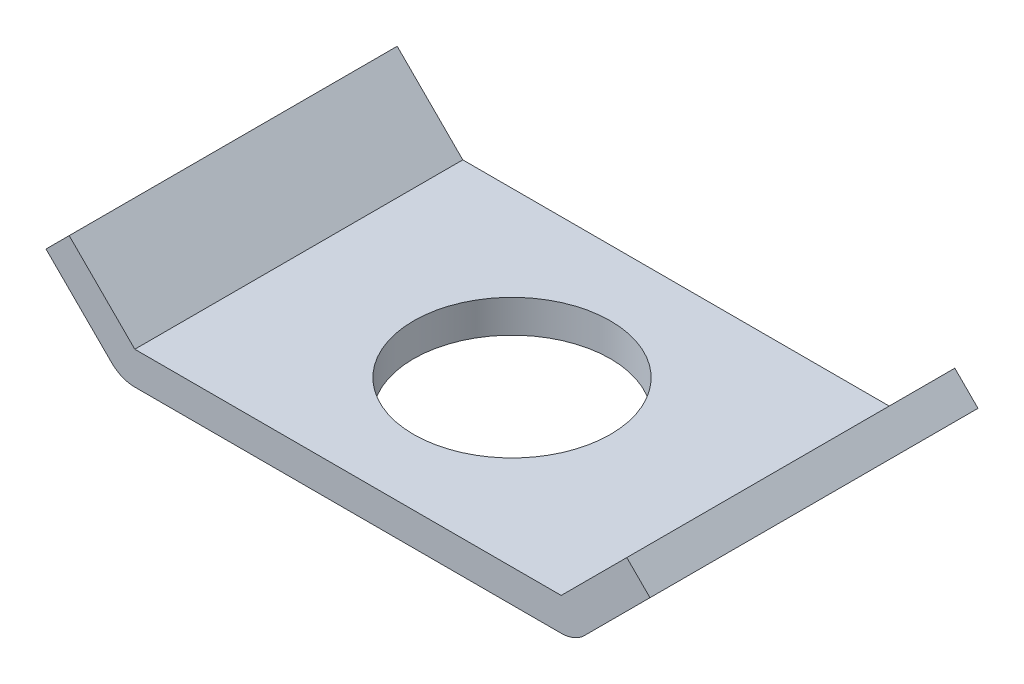
ISO-10303-21;
HEADER;
FILE_DESCRIPTION(('STEP AP214'),'2;1');
FILE_NAME('part.step','',(''),(''),'','','');
FILE_SCHEMA(('AUTOMOTIVE_DESIGN { 1 0 10303 214 1 1 1 1 }'));
ENDSEC;
DATA;
#1=APPLICATION_CONTEXT('core data for automotive mechanical design processes');
#2=APPLICATION_PROTOCOL_DEFINITION('international standard','automotive_design',2000,#1);
#3=PRODUCT_CONTEXT('',#1,'mechanical');
#4=PRODUCT('Part','Part','',(#3));
#5=PRODUCT_RELATED_PRODUCT_CATEGORY('part','',(#4));
#6=PRODUCT_DEFINITION_FORMATION('','',#4);
#7=PRODUCT_DEFINITION_CONTEXT('part definition',#1,'design');
#8=PRODUCT_DEFINITION('design','',#6,#7);
#9=PRODUCT_DEFINITION_SHAPE('','',#8);
#10=(LENGTH_UNIT() NAMED_UNIT(*) SI_UNIT(.MILLI.,.METRE.));
#11=(NAMED_UNIT(*) PLANE_ANGLE_UNIT() SI_UNIT($,.RADIAN.));
#12=(NAMED_UNIT(*) SI_UNIT($,.STERADIAN.) SOLID_ANGLE_UNIT());
#13=UNCERTAINTY_MEASURE_WITH_UNIT(LENGTH_MEASURE(1.E-05),#10,'distance_accuracy_value','');
#14=(GEOMETRIC_REPRESENTATION_CONTEXT(3) GLOBAL_UNCERTAINTY_ASSIGNED_CONTEXT((#13)) GLOBAL_UNIT_ASSIGNED_CONTEXT((#10,
#11,#12)) REPRESENTATION_CONTEXT('',''));
#15=CARTESIAN_POINT('',(0.,0.,0.));
#16=DIRECTION('',(0.,0.,1.));
#17=DIRECTION('',(1.,0.,0.));
#18=AXIS2_PLACEMENT_3D('',#15,#16,#17);
#19=CARTESIAN_POINT('',(-3.25,0.,2.5));
#20=DIRECTION('',(-0.707106781186548,-0.707106781186548,0.));
#21=DIRECTION('',(0.707106781186548,-0.707106781186548,0.));
#22=AXIS2_PLACEMENT_3D('',#19,#20,#21);
#23=PLANE('',#22);
#24=DIRECTION('',(-0.707106781186548,0.707106781186548,0.));
#25=VECTOR('',#24,1.);
#26=CARTESIAN_POINT('',(-3.25,0.,-2.5));
#27=LINE('',#26,#25);
#28=CARTESIAN_POINT('',(-3.25,0.,-2.5));
#29=VERTEX_POINT('',#28);
#30=CARTESIAN_POINT('',(-4.25,1.,-2.5));
#31=VERTEX_POINT('',#30);
#32=EDGE_CURVE('E141',#29,#31,#27,.T.);
#33=ORIENTED_EDGE('',*,*,#32,.T.);
#34=DIRECTION('',(0.,0.,-1.));
#35=VECTOR('',#34,1.);
#36=CARTESIAN_POINT('',(-4.25,1.,2.5));
#37=LINE('',#36,#35);
#38=CARTESIAN_POINT('',(-4.25,1.,2.5));
#39=VERTEX_POINT('',#38);
#40=EDGE_CURVE('E11',#39,#31,#37,.T.);
#41=ORIENTED_EDGE('',*,*,#40,.F.);
#42=DIRECTION('',(-0.707106781186548,0.707106781186548,0.));
#43=VECTOR('',#42,1.);
#44=CARTESIAN_POINT('',(-3.25,0.,2.5));
#45=LINE('',#44,#43);
#46=CARTESIAN_POINT('',(-3.25,0.,2.5));
#47=VERTEX_POINT('',#46);
#48=EDGE_CURVE('E159',#47,#39,#45,.T.);
#49=ORIENTED_EDGE('',*,*,#48,.F.);
#50=DIRECTION('',(0.,0.,-1.));
#51=VECTOR('',#50,1.);
#52=CARTESIAN_POINT('',(-3.25,0.,2.5));
#53=LINE('',#52,#51);
#54=EDGE_CURVE('E137',#47,#29,#53,.T.);
#55=ORIENTED_EDGE('',*,*,#54,.T.);
#56=EDGE_LOOP('',(#33,#41,#49,#55));
#57=FACE_BOUND('',#56,.T.);
#58=ADVANCED_FACE('F32',(#57),#23,.F.);
#59=CARTESIAN_POINT('',(-4.25,1.,2.5));
#60=DIRECTION('',(0.707106781186548,-0.707106781186547,0.));
#61=DIRECTION('',(0.707106781186547,0.707106781186548,0.));
#62=AXIS2_PLACEMENT_3D('',#59,#60,#61);
#63=PLANE('',#62);
#64=DIRECTION('',(-0.707106781186547,-0.707106781186548,0.));
#65=VECTOR('',#64,1.);
#66=CARTESIAN_POINT('',(-4.25,1.,-2.5));
#67=LINE('',#66,#65);
#68=CARTESIAN_POINT('',(-4.60355339059327,0.646446609406725,-2.5));
#69=VERTEX_POINT('',#68);
#70=EDGE_CURVE('E144',#31,#69,#67,.T.);
#71=ORIENTED_EDGE('',*,*,#70,.T.);
#72=DIRECTION('',(0.,0.,-1.));
#73=VECTOR('',#72,1.);
#74=CARTESIAN_POINT('',(-4.60355339059327,0.646446609406725,2.5));
#75=LINE('',#74,#73);
#76=CARTESIAN_POINT('',(-4.60355339059327,0.646446609406725,2.5));
#77=VERTEX_POINT('',#76);
#78=EDGE_CURVE('E41',#77,#69,#75,.T.);
#79=ORIENTED_EDGE('',*,*,#78,.F.);
#80=DIRECTION('',(-0.707106781186547,-0.707106781186548,0.));
#81=VECTOR('',#80,1.);
#82=CARTESIAN_POINT('',(-4.25,1.,2.5));
#83=LINE('',#82,#81);
#84=EDGE_CURVE('E98',#39,#77,#83,.T.);
#85=ORIENTED_EDGE('',*,*,#84,.F.);
#86=ORIENTED_EDGE('',*,*,#40,.T.);
#87=EDGE_LOOP('',(#71,#79,#85,#86));
#88=FACE_BOUND('',#87,.T.);
#89=ADVANCED_FACE('F225',(#88),#63,.F.);
#90=CARTESIAN_POINT('',(-3.60355339059328,-0.353553390593272,2.5));
#91=DIRECTION('',(0.707106781186547,0.707106781186548,0.));
#92=DIRECTION('',(-0.707106781186548,0.707106781186547,0.));
#93=AXIS2_PLACEMENT_3D('',#90,#91,#92);
#94=PLANE('',#93);
#95=DIRECTION('',(0.707106781186548,-0.707106781186547,0.));
#96=VECTOR('',#95,1.);
#97=CARTESIAN_POINT('',(-3.60355339059328,-0.353553390593272,-2.5));
#98=LINE('',#97,#96);
#99=CARTESIAN_POINT('',(-3.60355339059328,-0.353553390593273,-2.5));
#100=VERTEX_POINT('',#99);
#101=EDGE_CURVE('E146',#69,#100,#98,.T.);
#102=ORIENTED_EDGE('',*,*,#101,.T.);
#103=DIRECTION('',(0.,0.,-1.));
#104=VECTOR('',#103,1.);
#105=CARTESIAN_POINT('',(-3.60355339059328,-0.353553390593273,2.5));
#106=LINE('',#105,#104);
#107=CARTESIAN_POINT('',(-3.60355339059328,-0.353553390593273,2.5));
#108=VERTEX_POINT('',#107);
#109=EDGE_CURVE('E172',#108,#100,#106,.T.);
#110=ORIENTED_EDGE('',*,*,#109,.F.);
#111=DIRECTION('',(0.707106781186548,-0.707106781186547,0.));
#112=VECTOR('',#111,1.);
#113=CARTESIAN_POINT('',(-3.60355339059328,-0.353553390593272,2.5));
#114=LINE('',#113,#112);
#115=EDGE_CURVE('E181',#77,#108,#114,.T.);
#116=ORIENTED_EDGE('',*,*,#115,.F.);
#117=ORIENTED_EDGE('',*,*,#78,.T.);
#118=EDGE_LOOP('',(#102,#110,#116,#117));
#119=FACE_BOUND('',#118,.T.);
#120=ADVANCED_FACE('F179',(#119),#94,.F.);
#121=CARTESIAN_POINT('',(-3.25,0.,2.5));
#122=DIRECTION('',(0.,0.,-1.));
#123=DIRECTION('',(-1.,0.,0.));
#124=AXIS2_PLACEMENT_3D('',#121,#122,#123);
#125=CYLINDRICAL_SURFACE('',#124,0.5);
#126=CARTESIAN_POINT('',(-3.25,0.,-2.5));
#127=DIRECTION('',(0.,0.,1.));
#128=DIRECTION('',(-1.,0.,0.));
#129=AXIS2_PLACEMENT_3D('',#126,#127,#128);
#130=CIRCLE('',#129,0.5);
#131=CARTESIAN_POINT('',(-3.25,-0.5,-2.5));
#132=VERTEX_POINT('',#131);
#133=EDGE_CURVE('E148',#100,#132,#130,.T.);
#134=ORIENTED_EDGE('',*,*,#133,.T.);
#135=DIRECTION('',(0.,0.,-1.));
#136=VECTOR('',#135,1.);
#137=CARTESIAN_POINT('',(-3.25,-0.5,2.5));
#138=LINE('',#137,#136);
#139=CARTESIAN_POINT('',(-3.25,-0.5,2.5));
#140=VERTEX_POINT('',#139);
#141=EDGE_CURVE('E169',#140,#132,#138,.T.);
#142=ORIENTED_EDGE('',*,*,#141,.F.);
#143=CARTESIAN_POINT('',(-3.25,0.,2.5));
#144=DIRECTION('',(0.,0.,1.));
#145=DIRECTION('',(-1.,0.,0.));
#146=AXIS2_PLACEMENT_3D('',#143,#144,#145);
#147=CIRCLE('',#146,0.5);
#148=EDGE_CURVE('E199',#108,#140,#147,.T.);
#149=ORIENTED_EDGE('',*,*,#148,.F.);
#150=ORIENTED_EDGE('',*,*,#109,.T.);
#151=EDGE_LOOP('',(#134,#142,#149,#150));
#152=FACE_BOUND('',#151,.T.);
#153=ADVANCED_FACE('F190',(#152),#125,.T.);
#154=CARTESIAN_POINT('',(-3.25,-0.5,2.5));
#155=DIRECTION('',(0.,1.,0.));
#156=DIRECTION('',(0.,0.,1.));
#157=AXIS2_PLACEMENT_3D('',#154,#155,#156);
#158=PLANE('',#157);
#159=CARTESIAN_POINT('',(0.,-0.5,0.));
#160=DIRECTION('',(0.,-1.,0.));
#161=DIRECTION('',(0.,0.,-1.));
#162=AXIS2_PLACEMENT_3D('',#159,#160,#161);
#163=CIRCLE('',#162,1.5);
#164=CARTESIAN_POINT('',(0.,-0.5,-1.5));
#165=VERTEX_POINT('',#164);
#166=EDGE_CURVE('E207',#165,#165,#163,.T.);
#167=ORIENTED_EDGE('',*,*,#166,.F.);
#168=EDGE_LOOP('',(#167));
#169=FACE_BOUND('',#168,.T.);
#170=DIRECTION('',(1.,0.,0.));
#171=VECTOR('',#170,1.);
#172=CARTESIAN_POINT('',(-3.25,-0.5,-2.5));
#173=LINE('',#172,#171);
#174=CARTESIAN_POINT('',(3.25,-0.5,-2.5));
#175=VERTEX_POINT('',#174);
#176=EDGE_CURVE('E150',#132,#175,#173,.T.);
#177=ORIENTED_EDGE('',*,*,#176,.T.);
#178=DIRECTION('',(0.,0.,-1.));
#179=VECTOR('',#178,1.);
#180=CARTESIAN_POINT('',(3.25,-0.5,2.5));
#181=LINE('',#180,#179);
#182=CARTESIAN_POINT('',(3.25,-0.5,2.5));
#183=VERTEX_POINT('',#182);
#184=EDGE_CURVE('E166',#183,#175,#181,.T.);
#185=ORIENTED_EDGE('',*,*,#184,.F.);
#186=DIRECTION('',(1.,0.,0.));
#187=VECTOR('',#186,1.);
#188=CARTESIAN_POINT('',(-3.25,-0.5,2.5));
#189=LINE('',#188,#187);
#190=EDGE_CURVE('E196',#140,#183,#189,.T.);
#191=ORIENTED_EDGE('',*,*,#190,.F.);
#192=ORIENTED_EDGE('',*,*,#141,.T.);
#193=EDGE_LOOP('',(#177,#185,#191,#192));
#194=FACE_BOUND('',#193,.T.);
#195=ADVANCED_FACE('F194',(#169,#194),#158,.F.);
#196=CARTESIAN_POINT('',(3.25,0.,2.5));
#197=DIRECTION('',(0.,0.,-1.));
#198=DIRECTION('',(-1.,0.,0.));
#199=AXIS2_PLACEMENT_3D('',#196,#197,#198);
#200=CYLINDRICAL_SURFACE('',#199,0.5);
#201=CARTESIAN_POINT('',(3.25,0.,-2.5));
#202=DIRECTION('',(0.,0.,1.));
#203=DIRECTION('',(-1.,0.,0.));
#204=AXIS2_PLACEMENT_3D('',#201,#202,#203);
#205=CIRCLE('',#204,0.5);
#206=CARTESIAN_POINT('',(3.60355339059328,-0.353553390593272,-2.5));
#207=VERTEX_POINT('',#206);
#208=EDGE_CURVE('E152',#175,#207,#205,.T.);
#209=ORIENTED_EDGE('',*,*,#208,.T.);
#210=DIRECTION('',(0.,0.,-1.));
#211=VECTOR('',#210,1.);
#212=CARTESIAN_POINT('',(3.60355339059328,-0.353553390593272,2.5));
#213=LINE('',#212,#211);
#214=CARTESIAN_POINT('',(3.60355339059328,-0.353553390593272,2.5));
#215=VERTEX_POINT('',#214);
#216=EDGE_CURVE('E163',#215,#207,#213,.T.);
#217=ORIENTED_EDGE('',*,*,#216,.F.);
#218=CARTESIAN_POINT('',(3.25,0.,2.5));
#219=DIRECTION('',(0.,0.,1.));
#220=DIRECTION('',(-1.,0.,0.));
#221=AXIS2_PLACEMENT_3D('',#218,#219,#220);
#222=CIRCLE('',#221,0.5);
#223=EDGE_CURVE('E198',#183,#215,#222,.T.);
#224=ORIENTED_EDGE('',*,*,#223,.F.);
#225=ORIENTED_EDGE('',*,*,#184,.T.);
#226=EDGE_LOOP('',(#209,#217,#224,#225));
#227=FACE_BOUND('',#226,.T.);
#228=ADVANCED_FACE('F237',(#227),#200,.T.);
#229=CARTESIAN_POINT('',(3.60355339059328,-0.353553390593272,2.5));
#230=DIRECTION('',(-0.707106781186548,0.707106781186547,0.));
#231=DIRECTION('',(-0.707106781186547,-0.707106781186548,0.));
#232=AXIS2_PLACEMENT_3D('',#229,#230,#231);
#233=PLANE('',#232);
#234=DIRECTION('',(0.707106781186547,0.707106781186548,0.));
#235=VECTOR('',#234,1.);
#236=CARTESIAN_POINT('',(3.60355339059328,-0.353553390593272,-2.5));
#237=LINE('',#236,#235);
#238=CARTESIAN_POINT('',(4.60355339059327,0.646446609406725,-2.5));
#239=VERTEX_POINT('',#238);
#240=EDGE_CURVE('E154',#207,#239,#237,.T.);
#241=ORIENTED_EDGE('',*,*,#240,.T.);
#242=DIRECTION('',(0.,0.,-1.));
#243=VECTOR('',#242,1.);
#244=CARTESIAN_POINT('',(4.60355339059327,0.646446609406725,2.5));
#245=LINE('',#244,#243);
#246=CARTESIAN_POINT('',(4.60355339059327,0.646446609406725,2.5));
#247=VERTEX_POINT('',#246);
#248=EDGE_CURVE('E132',#247,#239,#245,.T.);
#249=ORIENTED_EDGE('',*,*,#248,.F.);
#250=DIRECTION('',(0.707106781186547,0.707106781186548,0.));
#251=VECTOR('',#250,1.);
#252=CARTESIAN_POINT('',(3.60355339059328,-0.353553390593272,2.5));
#253=LINE('',#252,#251);
#254=EDGE_CURVE('E123',#215,#247,#253,.T.);
#255=ORIENTED_EDGE('',*,*,#254,.F.);
#256=ORIENTED_EDGE('',*,*,#216,.T.);
#257=EDGE_LOOP('',(#241,#249,#255,#256));
#258=FACE_BOUND('',#257,.T.);
#259=ADVANCED_FACE('F234',(#258),#233,.F.);
#260=CARTESIAN_POINT('',(4.25,1.,2.5));
#261=DIRECTION('',(-0.707106781186548,-0.707106781186547,0.));
#262=DIRECTION('',(0.707106781186547,-0.707106781186548,0.));
#263=AXIS2_PLACEMENT_3D('',#260,#261,#262);
#264=PLANE('',#263);
#265=DIRECTION('',(-0.707106781186547,0.707106781186548,0.));
#266=VECTOR('',#265,1.);
#267=CARTESIAN_POINT('',(4.25,1.,-2.5));
#268=LINE('',#267,#266);
#269=CARTESIAN_POINT('',(4.25,1.,-2.5));
#270=VERTEX_POINT('',#269);
#271=EDGE_CURVE('E131',#239,#270,#268,.T.);
#272=ORIENTED_EDGE('',*,*,#271,.T.);
#273=DIRECTION('',(0.,0.,-1.));
#274=VECTOR('',#273,1.);
#275=CARTESIAN_POINT('',(4.25,1.,2.5));
#276=LINE('',#275,#274);
#277=CARTESIAN_POINT('',(4.25,1.,2.5));
#278=VERTEX_POINT('',#277);
#279=EDGE_CURVE('E128',#278,#270,#276,.T.);
#280=ORIENTED_EDGE('',*,*,#279,.F.);
#281=DIRECTION('',(-0.707106781186547,0.707106781186548,0.));
#282=VECTOR('',#281,1.);
#283=CARTESIAN_POINT('',(4.25,1.,2.5));
#284=LINE('',#283,#282);
#285=EDGE_CURVE('E117',#247,#278,#284,.T.);
#286=ORIENTED_EDGE('',*,*,#285,.F.);
#287=ORIENTED_EDGE('',*,*,#248,.T.);
#288=EDGE_LOOP('',(#272,#280,#286,#287));
#289=FACE_BOUND('',#288,.T.);
#290=ADVANCED_FACE('F129',(#289),#264,.F.);
#291=CARTESIAN_POINT('',(3.25,0.,2.5));
#292=DIRECTION('',(0.707106781186548,-0.707106781186548,0.));
#293=DIRECTION('',(0.707106781186548,0.707106781186548,0.));
#294=AXIS2_PLACEMENT_3D('',#291,#292,#293);
#295=PLANE('',#294);
#296=DIRECTION('',(-0.707106781186548,-0.707106781186548,0.));
#297=VECTOR('',#296,1.);
#298=CARTESIAN_POINT('',(3.25,0.,-2.5));
#299=LINE('',#298,#297);
#300=CARTESIAN_POINT('',(3.25,0.,-2.5));
#301=VERTEX_POINT('',#300);
#302=EDGE_CURVE('E84',#270,#301,#299,.T.);
#303=ORIENTED_EDGE('',*,*,#302,.T.);
#304=DIRECTION('',(0.,0.,-1.));
#305=VECTOR('',#304,1.);
#306=CARTESIAN_POINT('',(3.25,0.,2.5));
#307=LINE('',#306,#305);
#308=CARTESIAN_POINT('',(3.25,0.,2.5));
#309=VERTEX_POINT('',#308);
#310=EDGE_CURVE('E133',#309,#301,#307,.T.);
#311=ORIENTED_EDGE('',*,*,#310,.F.);
#312=DIRECTION('',(-0.707106781186548,-0.707106781186548,0.));
#313=VECTOR('',#312,1.);
#314=CARTESIAN_POINT('',(3.25,0.,2.5));
#315=LINE('',#314,#313);
#316=EDGE_CURVE('E121',#278,#309,#315,.T.);
#317=ORIENTED_EDGE('',*,*,#316,.F.);
#318=ORIENTED_EDGE('',*,*,#279,.T.);
#319=EDGE_LOOP('',(#303,#311,#317,#318));
#320=FACE_BOUND('',#319,.T.);
#321=ADVANCED_FACE('F135',(#320),#295,.F.);
#322=CARTESIAN_POINT('',(-3.25,0.,2.5));
#323=DIRECTION('',(0.,-1.,0.));
#324=DIRECTION('',(0.,0.,-1.));
#325=AXIS2_PLACEMENT_3D('',#322,#323,#324);
#326=PLANE('',#325);
#327=CARTESIAN_POINT('',(0.,0.,0.));
#328=DIRECTION('',(0.,-1.,0.));
#329=DIRECTION('',(0.,0.,-1.));
#330=AXIS2_PLACEMENT_3D('',#327,#328,#329);
#331=CIRCLE('',#330,1.5);
#332=CARTESIAN_POINT('',(0.,0.,-1.5));
#333=VERTEX_POINT('',#332);
#334=EDGE_CURVE('E35',#333,#333,#331,.T.);
#335=ORIENTED_EDGE('',*,*,#334,.T.);
#336=EDGE_LOOP('',(#335));
#337=FACE_BOUND('',#336,.T.);
#338=DIRECTION('',(-1.,0.,0.));
#339=VECTOR('',#338,1.);
#340=CARTESIAN_POINT('',(-3.25,0.,-2.5));
#341=LINE('',#340,#339);
#342=EDGE_CURVE('E90',#301,#29,#341,.T.);
#343=ORIENTED_EDGE('',*,*,#342,.T.);
#344=ORIENTED_EDGE('',*,*,#54,.F.);
#345=DIRECTION('',(-1.,0.,0.));
#346=VECTOR('',#345,1.);
#347=CARTESIAN_POINT('',(-3.25,0.,2.5));
#348=LINE('',#347,#346);
#349=EDGE_CURVE('E49',#309,#47,#348,.T.);
#350=ORIENTED_EDGE('',*,*,#349,.F.);
#351=ORIENTED_EDGE('',*,*,#310,.T.);
#352=EDGE_LOOP('',(#343,#344,#350,#351));
#353=FACE_BOUND('',#352,.T.);
#354=ADVANCED_FACE('F214',(#337,#353),#326,.F.);
#355=CARTESIAN_POINT('',(-3.25,0.,2.5));
#356=DIRECTION('',(0.,0.,-1.));
#357=DIRECTION('',(-1.,0.,0.));
#358=AXIS2_PLACEMENT_3D('',#355,#356,#357);
#359=PLANE('',#358);
#360=ORIENTED_EDGE('',*,*,#48,.T.);
#361=ORIENTED_EDGE('',*,*,#84,.T.);
#362=ORIENTED_EDGE('',*,*,#115,.T.);
#363=ORIENTED_EDGE('',*,*,#148,.T.);
#364=ORIENTED_EDGE('',*,*,#190,.T.);
#365=ORIENTED_EDGE('',*,*,#223,.T.);
#366=ORIENTED_EDGE('',*,*,#254,.T.);
#367=ORIENTED_EDGE('',*,*,#285,.T.);
#368=ORIENTED_EDGE('',*,*,#316,.T.);
#369=ORIENTED_EDGE('',*,*,#349,.T.);
#370=EDGE_LOOP('',(#360,#361,#362,#363,#364,#365,#366,#367,#368,#369));
#371=FACE_BOUND('',#370,.T.);
#372=ADVANCED_FACE('F119',(#371),#359,.F.);
#373=CARTESIAN_POINT('',(-3.25,0.,-2.5));
#374=DIRECTION('',(0.,0.,-1.));
#375=DIRECTION('',(-1.,0.,0.));
#376=AXIS2_PLACEMENT_3D('',#373,#374,#375);
#377=PLANE('',#376);
#378=ORIENTED_EDGE('',*,*,#32,.F.);
#379=ORIENTED_EDGE('',*,*,#342,.F.);
#380=ORIENTED_EDGE('',*,*,#302,.F.);
#381=ORIENTED_EDGE('',*,*,#271,.F.);
#382=ORIENTED_EDGE('',*,*,#240,.F.);
#383=ORIENTED_EDGE('',*,*,#208,.F.);
#384=ORIENTED_EDGE('',*,*,#176,.F.);
#385=ORIENTED_EDGE('',*,*,#133,.F.);
#386=ORIENTED_EDGE('',*,*,#101,.F.);
#387=ORIENTED_EDGE('',*,*,#70,.F.);
#388=EDGE_LOOP('',(#378,#379,#380,#381,#382,#383,#384,#385,#386,#387));
#389=FACE_BOUND('',#388,.T.);
#390=ADVANCED_FACE('F185',(#389),#377,.T.);
#391=CARTESIAN_POINT('',(0.,4.5,0.));
#392=DIRECTION('',(0.,-1.,0.));
#393=DIRECTION('',(0.,0.,-1.));
#394=AXIS2_PLACEMENT_3D('',#391,#392,#393);
#395=CYLINDRICAL_SURFACE('',#394,1.5);
#396=ORIENTED_EDGE('',*,*,#166,.T.);
#397=EDGE_LOOP('',(#396));
#398=FACE_BOUND('',#397,.T.);
#399=ORIENTED_EDGE('',*,*,#334,.F.);
#400=EDGE_LOOP('',(#399));
#401=FACE_BOUND('',#400,.T.);
#402=ADVANCED_FACE('F216',(#398,#401),#395,.F.);
#403=CLOSED_SHELL('',(#58,#89,#120,#153,#195,#228,#259,#290,#321,#354,#372,#390,#402));
#404=MANIFOLD_SOLID_BREP('B2',#403);
#405=ADVANCED_BREP_SHAPE_REPRESENTATION('',(#18,#404),#14);
#406=SHAPE_DEFINITION_REPRESENTATION(#9,#405);
ENDSEC;
END-ISO-10303-21;
